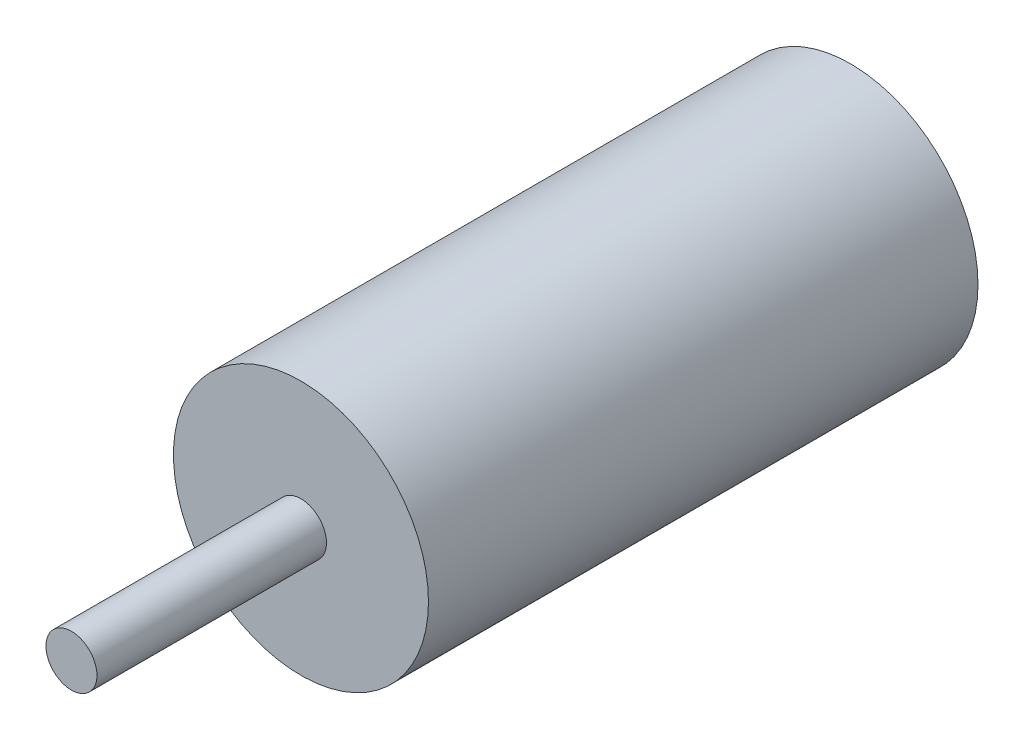
ISO-10303-21;
HEADER;
FILE_DESCRIPTION(('STEP AP214'),'2;1');
FILE_NAME('part.step','',(''),(''),'','','');
FILE_SCHEMA(('AUTOMOTIVE_DESIGN { 1 0 10303 214 1 1 1 1 }'));
ENDSEC;
DATA;
#1=APPLICATION_CONTEXT('core data for automotive mechanical design processes');
#2=APPLICATION_PROTOCOL_DEFINITION('international standard','automotive_design',2000,#1);
#3=PRODUCT_CONTEXT('',#1,'mechanical');
#4=PRODUCT('Part','Part','',(#3));
#5=PRODUCT_RELATED_PRODUCT_CATEGORY('part','',(#4));
#6=PRODUCT_DEFINITION_FORMATION('','',#4);
#7=PRODUCT_DEFINITION_CONTEXT('part definition',#1,'design');
#8=PRODUCT_DEFINITION('design','',#6,#7);
#9=PRODUCT_DEFINITION_SHAPE('','',#8);
#10=(LENGTH_UNIT() NAMED_UNIT(*) SI_UNIT(.MILLI.,.METRE.));
#11=(NAMED_UNIT(*) PLANE_ANGLE_UNIT() SI_UNIT($,.RADIAN.));
#12=(NAMED_UNIT(*) SI_UNIT($,.STERADIAN.) SOLID_ANGLE_UNIT());
#13=UNCERTAINTY_MEASURE_WITH_UNIT(LENGTH_MEASURE(1.E-05),#10,'distance_accuracy_value','');
#14=(GEOMETRIC_REPRESENTATION_CONTEXT(3) GLOBAL_UNCERTAINTY_ASSIGNED_CONTEXT((#13)) GLOBAL_UNIT_ASSIGNED_CONTEXT((#10,
#11,#12)) REPRESENTATION_CONTEXT('',''));
#15=CARTESIAN_POINT('',(0.,0.,0.));
#16=DIRECTION('',(0.,0.,1.));
#17=DIRECTION('',(1.,0.,0.));
#18=AXIS2_PLACEMENT_3D('',#15,#16,#17);
#19=CARTESIAN_POINT('',(0.,0.,43.1));
#20=DIRECTION('',(0.,0.,-1.));
#21=DIRECTION('',(-1.,0.,0.));
#22=AXIS2_PLACEMENT_3D('',#19,#20,#21);
#23=CYLINDRICAL_SURFACE('',#22,10.);
#24=CARTESIAN_POINT('',(0.,0.,43.1));
#25=DIRECTION('',(0.,0.,1.));
#26=DIRECTION('',(1.,0.,0.));
#27=AXIS2_PLACEMENT_3D('',#24,#25,#26);
#28=CIRCLE('',#27,10.);
#29=CARTESIAN_POINT('',(10.,0.,43.1));
#30=VERTEX_POINT('',#29);
#31=EDGE_CURVE('E42',#30,#30,#28,.T.);
#32=ORIENTED_EDGE('',*,*,#31,.F.);
#33=EDGE_LOOP('',(#32));
#34=FACE_BOUND('',#33,.T.);
#35=CARTESIAN_POINT('',(0.,0.,0.));
#36=DIRECTION('',(0.,0.,1.));
#37=DIRECTION('',(1.,0.,0.));
#38=AXIS2_PLACEMENT_3D('',#35,#36,#37);
#39=CIRCLE('',#38,10.);
#40=CARTESIAN_POINT('',(10.,0.,0.));
#41=VERTEX_POINT('',#40);
#42=EDGE_CURVE('E38',#41,#41,#39,.T.);
#43=ORIENTED_EDGE('',*,*,#42,.T.);
#44=EDGE_LOOP('',(#43));
#45=FACE_BOUND('',#44,.T.);
#46=ADVANCED_FACE('F35',(#34,#45),#23,.T.);
#47=CARTESIAN_POINT('',(0.,0.,43.1));
#48=DIRECTION('',(0.,0.,1.));
#49=DIRECTION('',(1.,0.,0.));
#50=AXIS2_PLACEMENT_3D('',#47,#48,#49);
#51=PLANE('',#50);
#52=CARTESIAN_POINT('',(0.,0.,43.1));
#53=DIRECTION('',(0.,0.,1.));
#54=DIRECTION('',(1.,0.,0.));
#55=AXIS2_PLACEMENT_3D('',#52,#53,#54);
#56=CIRCLE('',#55,2.);
#57=CARTESIAN_POINT('',(2.,0.,43.1));
#58=VERTEX_POINT('',#57);
#59=EDGE_CURVE('E11',#58,#58,#56,.T.);
#60=ORIENTED_EDGE('',*,*,#59,.F.);
#61=EDGE_LOOP('',(#60));
#62=FACE_BOUND('',#61,.T.);
#63=ORIENTED_EDGE('',*,*,#31,.T.);
#64=EDGE_LOOP('',(#63));
#65=FACE_BOUND('',#64,.T.);
#66=ADVANCED_FACE('F59',(#62,#65),#51,.T.);
#67=CARTESIAN_POINT('',(0.,0.,0.));
#68=DIRECTION('',(0.,0.,1.));
#69=DIRECTION('',(1.,0.,0.));
#70=AXIS2_PLACEMENT_3D('',#67,#68,#69);
#71=PLANE('',#70);
#72=ORIENTED_EDGE('',*,*,#42,.F.);
#73=EDGE_LOOP('',(#72));
#74=FACE_BOUND('',#73,.T.);
#75=ADVANCED_FACE('F56',(#74),#71,.F.);
#76=CARTESIAN_POINT('',(0.,0.,127.856854249492));
#77=DIRECTION('',(0.,0.,-1.));
#78=DIRECTION('',(-1.,0.,0.));
#79=AXIS2_PLACEMENT_3D('',#76,#77,#78);
#80=CYLINDRICAL_SURFACE('',#79,2.);
#81=ORIENTED_EDGE('',*,*,#59,.T.);
#82=EDGE_LOOP('',(#81));
#83=FACE_BOUND('',#82,.T.);
#84=CARTESIAN_POINT('',(0.,0.,61.1));
#85=DIRECTION('',(0.,0.,1.));
#86=DIRECTION('',(1.,0.,0.));
#87=AXIS2_PLACEMENT_3D('',#84,#85,#86);
#88=CIRCLE('',#87,2.);
#89=CARTESIAN_POINT('',(2.,0.,61.1));
#90=VERTEX_POINT('',#89);
#91=EDGE_CURVE('E48',#90,#90,#88,.T.);
#92=ORIENTED_EDGE('',*,*,#91,.F.);
#93=EDGE_LOOP('',(#92));
#94=FACE_BOUND('',#93,.T.);
#95=ADVANCED_FACE('F58',(#83,#94),#80,.T.);
#96=CARTESIAN_POINT('',(0.,0.,61.1));
#97=DIRECTION('',(0.,0.,1.));
#98=DIRECTION('',(1.,0.,0.));
#99=AXIS2_PLACEMENT_3D('',#96,#97,#98);
#100=PLANE('',#99);
#101=ORIENTED_EDGE('',*,*,#91,.T.);
#102=EDGE_LOOP('',(#101));
#103=FACE_BOUND('',#102,.T.);
#104=ADVANCED_FACE('F64',(#103),#100,.T.);
#105=CLOSED_SHELL('',(#46,#66,#75,#95,#104));
#106=MANIFOLD_SOLID_BREP('B2',#105);
#107=ADVANCED_BREP_SHAPE_REPRESENTATION('',(#18,#106),#14);
#108=SHAPE_DEFINITION_REPRESENTATION(#9,#107);
ENDSEC;
END-ISO-10303-21;
